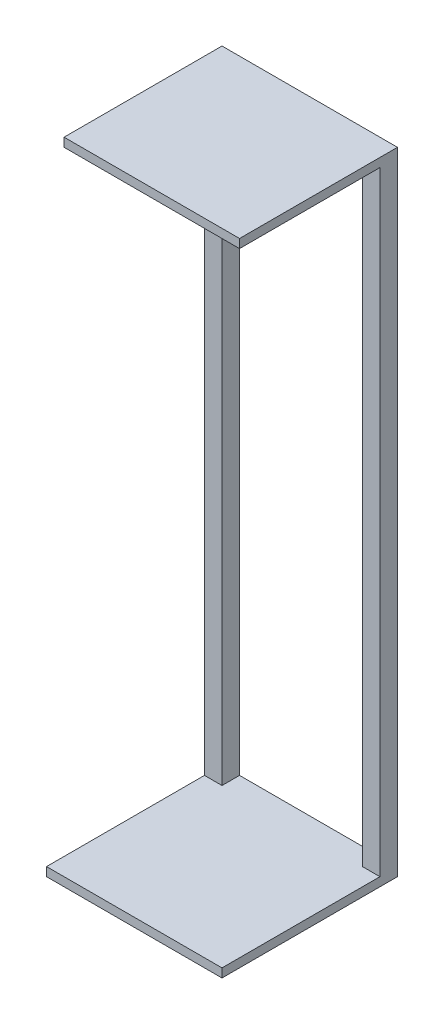
ISO-10303-21;
HEADER;
FILE_DESCRIPTION(('STEP AP214'),'2;1');
FILE_NAME('part.step','',(''),(''),'','','');
FILE_SCHEMA(('AUTOMOTIVE_DESIGN { 1 0 10303 214 1 1 1 1 }'));
ENDSEC;
DATA;
#1=APPLICATION_CONTEXT('core data for automotive mechanical design processes');
#2=APPLICATION_PROTOCOL_DEFINITION('international standard','automotive_design',2000,#1);
#3=PRODUCT_CONTEXT('',#1,'mechanical');
#4=PRODUCT('Part','Part','',(#3));
#5=PRODUCT_RELATED_PRODUCT_CATEGORY('part','',(#4));
#6=PRODUCT_DEFINITION_FORMATION('','',#4);
#7=PRODUCT_DEFINITION_CONTEXT('part definition',#1,'design');
#8=PRODUCT_DEFINITION('design','',#6,#7);
#9=PRODUCT_DEFINITION_SHAPE('','',#8);
#10=(LENGTH_UNIT() NAMED_UNIT(*) SI_UNIT(.MILLI.,.METRE.));
#11=(NAMED_UNIT(*) PLANE_ANGLE_UNIT() SI_UNIT($,.RADIAN.));
#12=(NAMED_UNIT(*) SI_UNIT($,.STERADIAN.) SOLID_ANGLE_UNIT());
#13=UNCERTAINTY_MEASURE_WITH_UNIT(LENGTH_MEASURE(1.E-05),#10,'distance_accuracy_value','');
#14=(GEOMETRIC_REPRESENTATION_CONTEXT(3) GLOBAL_UNCERTAINTY_ASSIGNED_CONTEXT((#13)) GLOBAL_UNIT_ASSIGNED_CONTEXT((#10,
#11,#12)) REPRESENTATION_CONTEXT('',''));
#15=CARTESIAN_POINT('',(0.,0.,0.));
#16=DIRECTION('',(0.,0.,1.));
#17=DIRECTION('',(1.,0.,0.));
#18=AXIS2_PLACEMENT_3D('',#15,#16,#17);
#19=CARTESIAN_POINT('',(0.,690.,-180.));
#20=DIRECTION('',(0.,0.,1.));
#21=DIRECTION('',(1.,0.,0.));
#22=AXIS2_PLACEMENT_3D('',#19,#20,#21);
#23=PLANE('',#22);
#24=DIRECTION('',(0.,-1.,0.));
#25=VECTOR('',#24,1.);
#26=CARTESIAN_POINT('',(85.,710.,-180.));
#27=LINE('',#26,#25);
#28=CARTESIAN_POINT('',(85.,710.,-180.));
#29=VERTEX_POINT('',#28);
#30=CARTESIAN_POINT('',(85.,690.,-180.));
#31=VERTEX_POINT('',#30);
#32=EDGE_CURVE('E250',#29,#31,#27,.T.);
#33=ORIENTED_EDGE('',*,*,#32,.F.);
#34=DIRECTION('',(1.,0.,0.));
#35=VECTOR('',#34,1.);
#36=CARTESIAN_POINT('',(0.,710.,-180.));
#37=LINE('',#36,#35);
#38=CARTESIAN_POINT('',(80.,710.,-180.));
#39=VERTEX_POINT('',#38);
#40=EDGE_CURVE('E272',#39,#29,#37,.T.);
#41=ORIENTED_EDGE('',*,*,#40,.F.);
#42=DIRECTION('',(0.,1.,0.));
#43=VECTOR('',#42,1.);
#44=CARTESIAN_POINT('',(80.,690.,-180.));
#45=LINE('',#44,#43);
#46=CARTESIAN_POINT('',(80.,690.,-180.));
#47=VERTEX_POINT('',#46);
#48=EDGE_CURVE('E278',#47,#39,#45,.T.);
#49=ORIENTED_EDGE('',*,*,#48,.F.);
#50=DIRECTION('',(1.,0.,0.));
#51=VECTOR('',#50,1.);
#52=CARTESIAN_POINT('',(0.,690.,-180.));
#53=LINE('',#52,#51);
#54=EDGE_CURVE('E262',#47,#31,#53,.T.);
#55=ORIENTED_EDGE('',*,*,#54,.T.);
#56=EDGE_LOOP('',(#33,#41,#49,#55));
#57=FACE_BOUND('',#56,.T.);
#58=ADVANCED_FACE('F39',(#57),#23,.T.);
#59=CARTESIAN_POINT('',(51.7157287525381,690.,-190.));
#60=DIRECTION('',(1.,0.,0.));
#61=DIRECTION('',(0.,0.,-1.));
#62=AXIS2_PLACEMENT_3D('',#59,#60,#61);
#63=CYLINDRICAL_SURFACE('',#62,10.);
#64=CARTESIAN_POINT('',(85.,690.,-190.));
#65=DIRECTION('',(-1.,0.,0.));
#66=DIRECTION('',(0.,0.,1.));
#67=AXIS2_PLACEMENT_3D('',#64,#65,#66);
#68=CIRCLE('',#67,10.);
#69=CARTESIAN_POINT('',(85.,690.,-200.));
#70=VERTEX_POINT('',#69);
#71=EDGE_CURVE('E11',#31,#70,#68,.F.);
#72=ORIENTED_EDGE('',*,*,#71,.F.);
#73=ORIENTED_EDGE('',*,*,#54,.F.);
#74=CARTESIAN_POINT('',(80.,690.,-190.));
#75=DIRECTION('',(1.,0.,0.));
#76=DIRECTION('',(0.,0.,-1.));
#77=AXIS2_PLACEMENT_3D('',#74,#75,#76);
#78=CIRCLE('',#77,10.);
#79=CARTESIAN_POINT('',(80.,690.,-200.));
#80=VERTEX_POINT('',#79);
#81=EDGE_CURVE('E258',#80,#47,#78,.F.);
#82=ORIENTED_EDGE('',*,*,#81,.F.);
#83=DIRECTION('',(1.,0.,0.));
#84=VECTOR('',#83,1.);
#85=CARTESIAN_POINT('',(0.,690.,-200.));
#86=LINE('',#85,#84);
#87=EDGE_CURVE('E266',#80,#70,#86,.T.);
#88=ORIENTED_EDGE('',*,*,#87,.T.);
#89=EDGE_LOOP('',(#72,#73,#82,#88));
#90=FACE_BOUND('',#89,.T.);
#91=ADVANCED_FACE('F497',(#90),#63,.T.);
#92=CARTESIAN_POINT('',(0.,690.,-100.));
#93=DIRECTION('',(0.,0.,1.));
#94=DIRECTION('',(1.,0.,0.));
#95=AXIS2_PLACEMENT_3D('',#92,#93,#94);
#96=PLANE('',#95);
#97=DIRECTION('',(0.,-1.,0.));
#98=VECTOR('',#97,1.);
#99=CARTESIAN_POINT('',(85.,710.,-100.));
#100=LINE('',#99,#98);
#101=CARTESIAN_POINT('',(85.,710.,-100.));
#102=VERTEX_POINT('',#101);
#103=CARTESIAN_POINT('',(85.,690.,-100.));
#104=VERTEX_POINT('',#103);
#105=EDGE_CURVE('E287',#102,#104,#100,.T.);
#106=ORIENTED_EDGE('',*,*,#105,.F.);
#107=DIRECTION('',(1.,0.,0.));
#108=VECTOR('',#107,1.);
#109=CARTESIAN_POINT('',(0.,710.,-100.));
#110=LINE('',#109,#108);
#111=CARTESIAN_POINT('',(80.,710.,-100.));
#112=VERTEX_POINT('',#111);
#113=EDGE_CURVE('E321',#112,#102,#110,.T.);
#114=ORIENTED_EDGE('',*,*,#113,.F.);
#115=DIRECTION('',(0.,1.,0.));
#116=VECTOR('',#115,1.);
#117=CARTESIAN_POINT('',(80.,690.,-100.));
#118=LINE('',#117,#116);
#119=CARTESIAN_POINT('',(80.,690.,-100.));
#120=VERTEX_POINT('',#119);
#121=EDGE_CURVE('E335',#120,#112,#118,.T.);
#122=ORIENTED_EDGE('',*,*,#121,.F.);
#123=DIRECTION('',(1.,0.,0.));
#124=VECTOR('',#123,1.);
#125=CARTESIAN_POINT('',(0.,690.,-100.));
#126=LINE('',#125,#124);
#127=EDGE_CURVE('E309',#120,#104,#126,.T.);
#128=ORIENTED_EDGE('',*,*,#127,.T.);
#129=EDGE_LOOP('',(#106,#114,#122,#128));
#130=FACE_BOUND('',#129,.T.);
#131=ADVANCED_FACE('F499',(#130),#96,.T.);
#132=CARTESIAN_POINT('',(0.,690.,-120.));
#133=DIRECTION('',(0.,0.,1.));
#134=DIRECTION('',(1.,0.,0.));
#135=AXIS2_PLACEMENT_3D('',#132,#133,#134);
#136=PLANE('',#135);
#137=DIRECTION('',(1.,0.,0.));
#138=VECTOR('',#137,1.);
#139=CARTESIAN_POINT('',(0.,710.,-120.));
#140=LINE('',#139,#138);
#141=CARTESIAN_POINT('',(80.,710.,-120.));
#142=VERTEX_POINT('',#141);
#143=CARTESIAN_POINT('',(85.,710.,-120.));
#144=VERTEX_POINT('',#143);
#145=EDGE_CURVE('E328',#142,#144,#140,.T.);
#146=ORIENTED_EDGE('',*,*,#145,.T.);
#147=DIRECTION('',(0.,-1.,0.));
#148=VECTOR('',#147,1.);
#149=CARTESIAN_POINT('',(85.,690.,-120.));
#150=LINE('',#149,#148);
#151=CARTESIAN_POINT('',(85.,690.,-120.));
#152=VERTEX_POINT('',#151);
#153=EDGE_CURVE('E299',#144,#152,#150,.T.);
#154=ORIENTED_EDGE('',*,*,#153,.T.);
#155=DIRECTION('',(1.,0.,0.));
#156=VECTOR('',#155,1.);
#157=CARTESIAN_POINT('',(0.,690.,-120.));
#158=LINE('',#157,#156);
#159=CARTESIAN_POINT('',(80.,690.,-120.));
#160=VERTEX_POINT('',#159);
#161=EDGE_CURVE('E314',#160,#152,#158,.T.);
#162=ORIENTED_EDGE('',*,*,#161,.F.);
#163=DIRECTION('',(0.,1.,0.));
#164=VECTOR('',#163,1.);
#165=CARTESIAN_POINT('',(80.,690.,-120.));
#166=LINE('',#165,#164);
#167=EDGE_CURVE('E333',#160,#142,#166,.T.);
#168=ORIENTED_EDGE('',*,*,#167,.T.);
#169=EDGE_LOOP('',(#146,#154,#162,#168));
#170=FACE_BOUND('',#169,.T.);
#171=ADVANCED_FACE('F506',(#170),#136,.F.);
#172=CARTESIAN_POINT('',(51.7157287525381,690.,-110.));
#173=DIRECTION('',(1.,0.,0.));
#174=DIRECTION('',(0.,0.,-1.));
#175=AXIS2_PLACEMENT_3D('',#172,#173,#174);
#176=CYLINDRICAL_SURFACE('',#175,10.);
#177=CARTESIAN_POINT('',(85.,690.,-110.));
#178=DIRECTION('',(-1.,0.,0.));
#179=DIRECTION('',(0.,0.,1.));
#180=AXIS2_PLACEMENT_3D('',#177,#178,#179);
#181=CIRCLE('',#180,10.);
#182=EDGE_CURVE('E440',#104,#152,#181,.F.);
#183=ORIENTED_EDGE('',*,*,#182,.F.);
#184=ORIENTED_EDGE('',*,*,#127,.F.);
#185=CARTESIAN_POINT('',(80.,690.,-110.));
#186=DIRECTION('',(1.,0.,0.));
#187=DIRECTION('',(0.,0.,-1.));
#188=AXIS2_PLACEMENT_3D('',#185,#186,#187);
#189=CIRCLE('',#188,10.);
#190=EDGE_CURVE('E305',#160,#120,#189,.F.);
#191=ORIENTED_EDGE('',*,*,#190,.F.);
#192=ORIENTED_EDGE('',*,*,#161,.T.);
#193=EDGE_LOOP('',(#183,#184,#191,#192));
#194=FACE_BOUND('',#193,.T.);
#195=ADVANCED_FACE('F542',(#194),#176,.T.);
#196=CARTESIAN_POINT('',(0.,10.,0.));
#197=DIRECTION('',(0.,-1.,0.));
#198=DIRECTION('',(0.,0.,-1.));
#199=AXIS2_PLACEMENT_3D('',#196,#197,#198);
#200=PLANE('',#199);
#201=DIRECTION('',(1.,0.,0.));
#202=VECTOR('',#201,1.);
#203=CARTESIAN_POINT('',(0.,10.,-180.));
#204=LINE('',#203,#202);
#205=CARTESIAN_POINT('',(0.,10.,-180.));
#206=VERTEX_POINT('',#205);
#207=CARTESIAN_POINT('',(20.,10.,-180.));
#208=VERTEX_POINT('',#207);
#209=EDGE_CURVE('E380',#206,#208,#204,.T.);
#210=ORIENTED_EDGE('',*,*,#209,.F.);
#211=DIRECTION('',(0.,0.,1.));
#212=VECTOR('',#211,1.);
#213=CARTESIAN_POINT('',(0.,10.,0.));
#214=LINE('',#213,#212);
#215=CARTESIAN_POINT('',(0.,10.,0.));
#216=VERTEX_POINT('',#215);
#217=EDGE_CURVE('E410',#206,#216,#214,.T.);
#218=ORIENTED_EDGE('',*,*,#217,.T.);
#219=DIRECTION('',(1.,0.,0.));
#220=VECTOR('',#219,1.);
#221=CARTESIAN_POINT('',(0.,10.,0.));
#222=LINE('',#221,#220);
#223=CARTESIAN_POINT('',(200.,10.,0.));
#224=VERTEX_POINT('',#223);
#225=EDGE_CURVE('E412',#216,#224,#222,.T.);
#226=ORIENTED_EDGE('',*,*,#225,.T.);
#227=DIRECTION('',(0.,0.,-1.));
#228=VECTOR('',#227,1.);
#229=CARTESIAN_POINT('',(200.,10.,0.));
#230=LINE('',#229,#228);
#231=CARTESIAN_POINT('',(200.,10.,-180.));
#232=VERTEX_POINT('',#231);
#233=EDGE_CURVE('E415',#224,#232,#230,.T.);
#234=ORIENTED_EDGE('',*,*,#233,.T.);
#235=DIRECTION('',(1.,0.,0.));
#236=VECTOR('',#235,1.);
#237=CARTESIAN_POINT('',(200.,10.,-180.));
#238=LINE('',#237,#236);
#239=CARTESIAN_POINT('',(180.,10.,-180.));
#240=VERTEX_POINT('',#239);
#241=EDGE_CURVE('E393',#240,#232,#238,.T.);
#242=ORIENTED_EDGE('',*,*,#241,.F.);
#243=DIRECTION('',(0.,0.,1.));
#244=VECTOR('',#243,1.);
#245=CARTESIAN_POINT('',(180.,10.,-200.));
#246=LINE('',#245,#244);
#247=CARTESIAN_POINT('',(180.,10.,-200.));
#248=VERTEX_POINT('',#247);
#249=EDGE_CURVE('E384',#248,#240,#246,.T.);
#250=ORIENTED_EDGE('',*,*,#249,.F.);
#251=DIRECTION('',(-1.,0.,0.));
#252=VECTOR('',#251,1.);
#253=CARTESIAN_POINT('',(0.,10.,-200.));
#254=LINE('',#253,#252);
#255=CARTESIAN_POINT('',(20.,10.,-200.));
#256=VERTEX_POINT('',#255);
#257=EDGE_CURVE('E417',#248,#256,#254,.T.);
#258=ORIENTED_EDGE('',*,*,#257,.T.);
#259=DIRECTION('',(0.,0.,-1.));
#260=VECTOR('',#259,1.);
#261=CARTESIAN_POINT('',(20.,10.,-200.));
#262=LINE('',#261,#260);
#263=EDGE_CURVE('E377',#208,#256,#262,.T.);
#264=ORIENTED_EDGE('',*,*,#263,.F.);
#265=EDGE_LOOP('',(#210,#218,#226,#234,#242,#250,#258,#264));
#266=FACE_BOUND('',#265,.T.);
#267=ADVANCED_FACE('F574',(#266),#200,.F.);
#268=CARTESIAN_POINT('',(0.,10.,0.));
#269=DIRECTION('',(1.,0.,0.));
#270=DIRECTION('',(0.,0.,-1.));
#271=AXIS2_PLACEMENT_3D('',#268,#269,#270);
#272=PLANE('',#271);
#273=DIRECTION('',(0.,0.,1.));
#274=VECTOR('',#273,1.);
#275=CARTESIAN_POINT('',(0.,0.,0.));
#276=LINE('',#275,#274);
#277=CARTESIAN_POINT('',(0.,0.,-200.));
#278=VERTEX_POINT('',#277);
#279=CARTESIAN_POINT('',(0.,0.,0.));
#280=VERTEX_POINT('',#279);
#281=EDGE_CURVE('E409',#278,#280,#276,.T.);
#282=ORIENTED_EDGE('',*,*,#281,.T.);
#283=DIRECTION('',(0.,-1.,0.));
#284=VECTOR('',#283,1.);
#285=CARTESIAN_POINT('',(0.,10.,0.));
#286=LINE('',#285,#284);
#287=EDGE_CURVE('E435',#216,#280,#286,.T.);
#288=ORIENTED_EDGE('',*,*,#287,.F.);
#289=ORIENTED_EDGE('',*,*,#217,.F.);
#290=DIRECTION('',(0.,-1.,0.));
#291=VECTOR('',#290,1.);
#292=CARTESIAN_POINT('',(0.,710.,-180.));
#293=LINE('',#292,#291);
#294=CARTESIAN_POINT('',(0.,710.,-180.));
#295=VERTEX_POINT('',#294);
#296=EDGE_CURVE('E367',#295,#206,#293,.T.);
#297=ORIENTED_EDGE('',*,*,#296,.F.);
#298=DIRECTION('',(0.,0.,1.));
#299=VECTOR('',#298,1.);
#300=CARTESIAN_POINT('',(0.,710.,-200.));
#301=LINE('',#300,#299);
#302=CARTESIAN_POINT('',(0.,710.,-20.));
#303=VERTEX_POINT('',#302);
#304=EDGE_CURVE('E359',#295,#303,#301,.T.);
#305=ORIENTED_EDGE('',*,*,#304,.T.);
#306=DIRECTION('',(0.,-1.,0.));
#307=VECTOR('',#306,1.);
#308=CARTESIAN_POINT('',(0.,720.,-20.));
#309=LINE('',#308,#307);
#310=CARTESIAN_POINT('',(0.,720.,-20.));
#311=VERTEX_POINT('',#310);
#312=EDGE_CURVE('E364',#311,#303,#309,.T.);
#313=ORIENTED_EDGE('',*,*,#312,.F.);
#314=DIRECTION('',(0.,0.,1.));
#315=VECTOR('',#314,1.);
#316=CARTESIAN_POINT('',(0.,720.,-200.));
#317=LINE('',#316,#315);
#318=CARTESIAN_POINT('',(0.,720.,-200.));
#319=VERTEX_POINT('',#318);
#320=EDGE_CURVE('E348',#319,#311,#317,.T.);
#321=ORIENTED_EDGE('',*,*,#320,.F.);
#322=DIRECTION('',(0.,-1.,0.));
#323=VECTOR('',#322,1.);
#324=CARTESIAN_POINT('',(0.,10.,-200.));
#325=LINE('',#324,#323);
#326=EDGE_CURVE('E419',#319,#278,#325,.T.);
#327=ORIENTED_EDGE('',*,*,#326,.T.);
#328=EDGE_LOOP('',(#282,#288,#289,#297,#305,#313,#321,#327));
#329=FACE_BOUND('',#328,.T.);
#330=ADVANCED_FACE('F41',(#329),#272,.F.);
#331=CARTESIAN_POINT('',(0.,10.,0.));
#332=DIRECTION('',(0.,0.,-1.));
#333=DIRECTION('',(-1.,0.,0.));
#334=AXIS2_PLACEMENT_3D('',#331,#332,#333);
#335=PLANE('',#334);
#336=DIRECTION('',(1.,0.,0.));
#337=VECTOR('',#336,1.);
#338=CARTESIAN_POINT('',(0.,0.,0.));
#339=LINE('',#338,#337);
#340=CARTESIAN_POINT('',(200.,0.,0.));
#341=VERTEX_POINT('',#340);
#342=EDGE_CURVE('E422',#280,#341,#339,.T.);
#343=ORIENTED_EDGE('',*,*,#342,.T.);
#344=DIRECTION('',(0.,-1.,0.));
#345=VECTOR('',#344,1.);
#346=CARTESIAN_POINT('',(200.,10.,0.));
#347=LINE('',#346,#345);
#348=EDGE_CURVE('E432',#224,#341,#347,.T.);
#349=ORIENTED_EDGE('',*,*,#348,.F.);
#350=ORIENTED_EDGE('',*,*,#225,.F.);
#351=ORIENTED_EDGE('',*,*,#287,.T.);
#352=EDGE_LOOP('',(#343,#349,#350,#351));
#353=FACE_BOUND('',#352,.T.);
#354=ADVANCED_FACE('F583',(#353),#335,.F.);
#355=CARTESIAN_POINT('',(200.,10.,0.));
#356=DIRECTION('',(-1.,0.,0.));
#357=DIRECTION('',(0.,0.,1.));
#358=AXIS2_PLACEMENT_3D('',#355,#356,#357);
#359=PLANE('',#358);
#360=DIRECTION('',(0.,0.,-1.));
#361=VECTOR('',#360,1.);
#362=CARTESIAN_POINT('',(200.,0.,0.));
#363=LINE('',#362,#361);
#364=CARTESIAN_POINT('',(200.,0.,-200.));
#365=VERTEX_POINT('',#364);
#366=EDGE_CURVE('E424',#341,#365,#363,.T.);
#367=ORIENTED_EDGE('',*,*,#366,.T.);
#368=DIRECTION('',(0.,-1.,0.));
#369=VECTOR('',#368,1.);
#370=CARTESIAN_POINT('',(200.,10.,-200.));
#371=LINE('',#370,#369);
#372=CARTESIAN_POINT('',(200.,720.,-200.));
#373=VERTEX_POINT('',#372);
#374=EDGE_CURVE('E429',#373,#365,#371,.T.);
#375=ORIENTED_EDGE('',*,*,#374,.F.);
#376=DIRECTION('',(0.,0.,-1.));
#377=VECTOR('',#376,1.);
#378=CARTESIAN_POINT('',(200.,720.,-200.));
#379=LINE('',#378,#377);
#380=CARTESIAN_POINT('',(200.,720.,-20.));
#381=VERTEX_POINT('',#380);
#382=EDGE_CURVE('E341',#381,#373,#379,.T.);
#383=ORIENTED_EDGE('',*,*,#382,.F.);
#384=DIRECTION('',(0.,-1.,0.));
#385=VECTOR('',#384,1.);
#386=CARTESIAN_POINT('',(200.,720.,-20.));
#387=LINE('',#386,#385);
#388=CARTESIAN_POINT('',(200.,710.,-20.));
#389=VERTEX_POINT('',#388);
#390=EDGE_CURVE('E352',#381,#389,#387,.T.);
#391=ORIENTED_EDGE('',*,*,#390,.T.);
#392=DIRECTION('',(0.,0.,-1.));
#393=VECTOR('',#392,1.);
#394=CARTESIAN_POINT('',(200.,710.,-200.));
#395=LINE('',#394,#393);
#396=CARTESIAN_POINT('',(200.,710.,-180.));
#397=VERTEX_POINT('',#396);
#398=EDGE_CURVE('E340',#389,#397,#395,.T.);
#399=ORIENTED_EDGE('',*,*,#398,.T.);
#400=DIRECTION('',(0.,-1.,0.));
#401=VECTOR('',#400,1.);
#402=CARTESIAN_POINT('',(200.,710.,-180.));
#403=LINE('',#402,#401);
#404=EDGE_CURVE('E396',#397,#232,#403,.T.);
#405=ORIENTED_EDGE('',*,*,#404,.T.);
#406=ORIENTED_EDGE('',*,*,#233,.F.);
#407=ORIENTED_EDGE('',*,*,#348,.T.);
#408=EDGE_LOOP('',(#367,#375,#383,#391,#399,#405,#406,#407));
#409=FACE_BOUND('',#408,.T.);
#410=ADVANCED_FACE('F464',(#409),#359,.F.);
#411=CARTESIAN_POINT('',(0.,10.,-200.));
#412=DIRECTION('',(0.,0.,1.));
#413=DIRECTION('',(1.,0.,0.));
#414=AXIS2_PLACEMENT_3D('',#411,#412,#413);
#415=PLANE('',#414);
#416=DIRECTION('',(-1.,0.,0.));
#417=VECTOR('',#416,1.);
#418=CARTESIAN_POINT('',(85.,710.,-200.));
#419=LINE('',#418,#417);
#420=CARTESIAN_POINT('',(115.,710.,-200.));
#421=VERTEX_POINT('',#420);
#422=CARTESIAN_POINT('',(85.,710.,-200.));
#423=VERTEX_POINT('',#422);
#424=EDGE_CURVE('E230',#421,#423,#419,.T.);
#425=ORIENTED_EDGE('',*,*,#424,.T.);
#426=DIRECTION('',(0.,-1.,0.));
#427=VECTOR('',#426,1.);
#428=CARTESIAN_POINT('',(85.,710.,-200.));
#429=LINE('',#428,#427);
#430=EDGE_CURVE('E245',#423,#70,#429,.T.);
#431=ORIENTED_EDGE('',*,*,#430,.T.);
#432=ORIENTED_EDGE('',*,*,#87,.F.);
#433=DIRECTION('',(0.,1.,0.));
#434=VECTOR('',#433,1.);
#435=CARTESIAN_POINT('',(80.,690.,-200.));
#436=LINE('',#435,#434);
#437=CARTESIAN_POINT('',(80.0000000000001,710.,-200.));
#438=VERTEX_POINT('',#437);
#439=EDGE_CURVE('E63',#80,#438,#436,.T.);
#440=ORIENTED_EDGE('',*,*,#439,.T.);
#441=DIRECTION('',(-1.,0.,0.));
#442=VECTOR('',#441,1.);
#443=CARTESIAN_POINT('',(200.,710.,-200.));
#444=LINE('',#443,#442);
#445=CARTESIAN_POINT('',(20.,710.,-200.));
#446=VERTEX_POINT('',#445);
#447=EDGE_CURVE('E355',#438,#446,#444,.T.);
#448=ORIENTED_EDGE('',*,*,#447,.T.);
#449=DIRECTION('',(0.,-1.,0.));
#450=VECTOR('',#449,1.);
#451=CARTESIAN_POINT('',(20.,710.,-200.));
#452=LINE('',#451,#450);
#453=EDGE_CURVE('E373',#446,#256,#452,.T.);
#454=ORIENTED_EDGE('',*,*,#453,.T.);
#455=ORIENTED_EDGE('',*,*,#257,.F.);
#456=DIRECTION('',(0.,-1.,0.));
#457=VECTOR('',#456,1.);
#458=CARTESIAN_POINT('',(180.,710.,-200.));
#459=LINE('',#458,#457);
#460=CARTESIAN_POINT('',(180.,710.,-200.));
#461=VERTEX_POINT('',#460);
#462=EDGE_CURVE('E406',#461,#248,#459,.T.);
#463=ORIENTED_EDGE('',*,*,#462,.F.);
#464=CARTESIAN_POINT('',(120.,710.,-200.));
#465=VERTEX_POINT('',#464);
#466=EDGE_CURVE('E356',#461,#465,#444,.T.);
#467=ORIENTED_EDGE('',*,*,#466,.T.);
#468=DIRECTION('',(0.,1.,0.));
#469=VECTOR('',#468,1.);
#470=CARTESIAN_POINT('',(120.,690.,-200.));
#471=LINE('',#470,#469);
#472=CARTESIAN_POINT('',(120.,690.,-200.));
#473=VERTEX_POINT('',#472);
#474=EDGE_CURVE('E269',#473,#465,#471,.T.);
#475=ORIENTED_EDGE('',*,*,#474,.F.);
#476=CARTESIAN_POINT('',(115.,690.,-200.));
#477=VERTEX_POINT('',#476);
#478=EDGE_CURVE('E244',#477,#473,#86,.T.);
#479=ORIENTED_EDGE('',*,*,#478,.F.);
#480=DIRECTION('',(0.,1.,0.));
#481=VECTOR('',#480,1.);
#482=CARTESIAN_POINT('',(115.,710.,-200.));
#483=LINE('',#482,#481);
#484=EDGE_CURVE('E55',#477,#421,#483,.T.);
#485=ORIENTED_EDGE('',*,*,#484,.T.);
#486=EDGE_LOOP('',(#425,#431,#432,#440,#448,#454,#455,#463,#467,#475,#479,#485));
#487=FACE_BOUND('',#486,.T.);
#488=DIRECTION('',(-1.,0.,0.));
#489=VECTOR('',#488,1.);
#490=CARTESIAN_POINT('',(0.,0.,-200.));
#491=LINE('',#490,#489);
#492=EDGE_CURVE('E413',#365,#278,#491,.T.);
#493=ORIENTED_EDGE('',*,*,#492,.T.);
#494=ORIENTED_EDGE('',*,*,#326,.F.);
#495=DIRECTION('',(-1.,0.,0.));
#496=VECTOR('',#495,1.);
#497=CARTESIAN_POINT('',(200.,720.,-200.));
#498=LINE('',#497,#496);
#499=EDGE_CURVE('E344',#373,#319,#498,.T.);
#500=ORIENTED_EDGE('',*,*,#499,.F.);
#501=ORIENTED_EDGE('',*,*,#374,.T.);
#502=EDGE_LOOP('',(#493,#494,#500,#501));
#503=FACE_BOUND('',#502,.T.);
#504=ADVANCED_FACE('F241',(#487,#503),#415,.F.);
#505=CARTESIAN_POINT('',(0.,0.,0.));
#506=DIRECTION('',(0.,-1.,0.));
#507=DIRECTION('',(0.,0.,-1.));
#508=AXIS2_PLACEMENT_3D('',#505,#506,#507);
#509=PLANE('',#508);
#510=ORIENTED_EDGE('',*,*,#281,.F.);
#511=ORIENTED_EDGE('',*,*,#492,.F.);
#512=ORIENTED_EDGE('',*,*,#366,.F.);
#513=ORIENTED_EDGE('',*,*,#342,.F.);
#514=EDGE_LOOP('',(#510,#511,#512,#513));
#515=FACE_BOUND('',#514,.T.);
#516=ADVANCED_FACE('F573',(#515),#509,.T.);
#517=CARTESIAN_POINT('',(180.,710.,-200.));
#518=DIRECTION('',(1.,0.,0.));
#519=DIRECTION('',(0.,0.,-1.));
#520=AXIS2_PLACEMENT_3D('',#517,#518,#519);
#521=PLANE('',#520);
#522=ORIENTED_EDGE('',*,*,#249,.T.);
#523=DIRECTION('',(0.,-1.,0.));
#524=VECTOR('',#523,1.);
#525=CARTESIAN_POINT('',(180.,710.,-180.));
#526=LINE('',#525,#524);
#527=CARTESIAN_POINT('',(180.,710.,-180.));
#528=VERTEX_POINT('',#527);
#529=EDGE_CURVE('E403',#528,#240,#526,.T.);
#530=ORIENTED_EDGE('',*,*,#529,.F.);
#531=DIRECTION('',(0.,0.,1.));
#532=VECTOR('',#531,1.);
#533=CARTESIAN_POINT('',(180.,710.,-200.));
#534=LINE('',#533,#532);
#535=EDGE_CURVE('E389',#461,#528,#534,.T.);
#536=ORIENTED_EDGE('',*,*,#535,.F.);
#537=ORIENTED_EDGE('',*,*,#462,.T.);
#538=EDGE_LOOP('',(#522,#530,#536,#537));
#539=FACE_BOUND('',#538,.T.);
#540=ADVANCED_FACE('F458',(#539),#521,.F.);
#541=CARTESIAN_POINT('',(200.,710.,-180.));
#542=DIRECTION('',(0.,0.,-1.));
#543=DIRECTION('',(-1.,0.,0.));
#544=AXIS2_PLACEMENT_3D('',#541,#542,#543);
#545=PLANE('',#544);
#546=ORIENTED_EDGE('',*,*,#241,.T.);
#547=ORIENTED_EDGE('',*,*,#404,.F.);
#548=DIRECTION('',(1.,0.,0.));
#549=VECTOR('',#548,1.);
#550=CARTESIAN_POINT('',(200.,710.,-180.));
#551=LINE('',#550,#549);
#552=EDGE_CURVE('E392',#528,#397,#551,.T.);
#553=ORIENTED_EDGE('',*,*,#552,.F.);
#554=ORIENTED_EDGE('',*,*,#529,.T.);
#555=EDGE_LOOP('',(#546,#547,#553,#554));
#556=FACE_BOUND('',#555,.T.);
#557=ADVANCED_FACE('F566',(#556),#545,.F.);
#558=CARTESIAN_POINT('',(0.,710.,-180.));
#559=DIRECTION('',(0.,0.,-1.));
#560=DIRECTION('',(-1.,0.,0.));
#561=AXIS2_PLACEMENT_3D('',#558,#559,#560);
#562=PLANE('',#561);
#563=ORIENTED_EDGE('',*,*,#209,.T.);
#564=DIRECTION('',(0.,-1.,0.));
#565=VECTOR('',#564,1.);
#566=CARTESIAN_POINT('',(20.,710.,-180.));
#567=LINE('',#566,#565);
#568=CARTESIAN_POINT('',(20.,710.,-180.));
#569=VERTEX_POINT('',#568);
#570=EDGE_CURVE('E370',#569,#208,#567,.T.);
#571=ORIENTED_EDGE('',*,*,#570,.F.);
#572=DIRECTION('',(1.,0.,0.));
#573=VECTOR('',#572,1.);
#574=CARTESIAN_POINT('',(0.,710.,-180.));
#575=LINE('',#574,#573);
#576=EDGE_CURVE('E381',#295,#569,#575,.T.);
#577=ORIENTED_EDGE('',*,*,#576,.F.);
#578=ORIENTED_EDGE('',*,*,#296,.T.);
#579=EDGE_LOOP('',(#563,#571,#577,#578));
#580=FACE_BOUND('',#579,.T.);
#581=ADVANCED_FACE('F479',(#580),#562,.F.);
#582=CARTESIAN_POINT('',(20.,710.,-200.));
#583=DIRECTION('',(-1.,0.,0.));
#584=DIRECTION('',(0.,0.,1.));
#585=AXIS2_PLACEMENT_3D('',#582,#583,#584);
#586=PLANE('',#585);
#587=ORIENTED_EDGE('',*,*,#263,.T.);
#588=ORIENTED_EDGE('',*,*,#453,.F.);
#589=DIRECTION('',(0.,0.,-1.));
#590=VECTOR('',#589,1.);
#591=CARTESIAN_POINT('',(20.,710.,-200.));
#592=LINE('',#591,#590);
#593=EDGE_CURVE('E376',#569,#446,#592,.T.);
#594=ORIENTED_EDGE('',*,*,#593,.F.);
#595=ORIENTED_EDGE('',*,*,#570,.T.);
#596=EDGE_LOOP('',(#587,#588,#594,#595));
#597=FACE_BOUND('',#596,.T.);
#598=ADVANCED_FACE('F483',(#597),#586,.F.);
#599=CARTESIAN_POINT('',(0.,710.,0.));
#600=DIRECTION('',(0.,-1.,0.));
#601=DIRECTION('',(0.,0.,-1.));
#602=AXIS2_PLACEMENT_3D('',#599,#600,#601);
#603=PLANE('',#602);
#604=DIRECTION('',(0.,0.,-1.));
#605=VECTOR('',#604,1.);
#606=CARTESIAN_POINT('',(120.,710.,-80.));
#607=LINE('',#606,#605);
#608=CARTESIAN_POINT('',(120.,710.,-180.));
#609=VERTEX_POINT('',#608);
#610=EDGE_CURVE('E261',#609,#465,#607,.T.);
#611=ORIENTED_EDGE('',*,*,#610,.T.);
#612=ORIENTED_EDGE('',*,*,#466,.F.);
#613=ORIENTED_EDGE('',*,*,#535,.T.);
#614=ORIENTED_EDGE('',*,*,#552,.T.);
#615=ORIENTED_EDGE('',*,*,#398,.F.);
#616=DIRECTION('',(1.,0.,0.));
#617=VECTOR('',#616,1.);
#618=CARTESIAN_POINT('',(200.,710.,-20.));
#619=LINE('',#618,#617);
#620=EDGE_CURVE('E345',#303,#389,#619,.T.);
#621=ORIENTED_EDGE('',*,*,#620,.F.);
#622=ORIENTED_EDGE('',*,*,#304,.F.);
#623=ORIENTED_EDGE('',*,*,#576,.T.);
#624=ORIENTED_EDGE('',*,*,#593,.T.);
#625=ORIENTED_EDGE('',*,*,#447,.F.);
#626=DIRECTION('',(0.,0.,-1.));
#627=VECTOR('',#626,1.);
#628=CARTESIAN_POINT('',(80.,710.,-80.));
#629=LINE('',#628,#627);
#630=EDGE_CURVE('E274',#39,#438,#629,.T.);
#631=ORIENTED_EDGE('',*,*,#630,.F.);
#632=ORIENTED_EDGE('',*,*,#40,.T.);
#633=DIRECTION('',(0.,0.,1.));
#634=VECTOR('',#633,1.);
#635=CARTESIAN_POINT('',(85.,710.,-200.));
#636=LINE('',#635,#634);
#637=EDGE_CURVE('E229',#423,#29,#636,.T.);
#638=ORIENTED_EDGE('',*,*,#637,.F.);
#639=ORIENTED_EDGE('',*,*,#424,.F.);
#640=DIRECTION('',(0.,0.,1.));
#641=VECTOR('',#640,1.);
#642=CARTESIAN_POINT('',(115.,710.,-200.));
#643=LINE('',#642,#641);
#644=CARTESIAN_POINT('',(115.,710.,-180.));
#645=VERTEX_POINT('',#644);
#646=EDGE_CURVE('E222',#421,#645,#643,.T.);
#647=ORIENTED_EDGE('',*,*,#646,.T.);
#648=EDGE_CURVE('E271',#645,#609,#37,.T.);
#649=ORIENTED_EDGE('',*,*,#648,.T.);
#650=EDGE_LOOP('',(#611,#612,#613,#614,#615,#621,#622,#623,#624,#625,#631,#632,#638,#639,#647,#649));
#651=FACE_BOUND('',#650,.T.);
#652=CARTESIAN_POINT('',(115.,710.,-120.));
#653=VERTEX_POINT('',#652);
#654=CARTESIAN_POINT('',(120.,710.,-120.));
#655=VERTEX_POINT('',#654);
#656=EDGE_CURVE('E327',#653,#655,#140,.T.);
#657=ORIENTED_EDGE('',*,*,#656,.F.);
#658=DIRECTION('',(0.,0.,1.));
#659=VECTOR('',#658,1.);
#660=CARTESIAN_POINT('',(115.,710.,-200.));
#661=LINE('',#660,#659);
#662=CARTESIAN_POINT('',(115.,710.,-100.));
#663=VERTEX_POINT('',#662);
#664=EDGE_CURVE('E292',#653,#663,#661,.T.);
#665=ORIENTED_EDGE('',*,*,#664,.T.);
#666=CARTESIAN_POINT('',(120.,710.,-100.));
#667=VERTEX_POINT('',#666);
#668=EDGE_CURVE('E320',#663,#667,#110,.T.);
#669=ORIENTED_EDGE('',*,*,#668,.T.);
#670=DIRECTION('',(0.,0.,-1.));
#671=VECTOR('',#670,1.);
#672=CARTESIAN_POINT('',(120.,710.,0.));
#673=LINE('',#672,#671);
#674=EDGE_CURVE('E308',#667,#655,#673,.T.);
#675=ORIENTED_EDGE('',*,*,#674,.T.);
#676=EDGE_LOOP('',(#657,#665,#669,#675));
#677=FACE_BOUND('',#676,.T.);
#678=DIRECTION('',(0.,0.,1.));
#679=VECTOR('',#678,1.);
#680=CARTESIAN_POINT('',(85.,710.,-200.));
#681=LINE('',#680,#679);
#682=EDGE_CURVE('E293',#144,#102,#681,.T.);
#683=ORIENTED_EDGE('',*,*,#682,.F.);
#684=ORIENTED_EDGE('',*,*,#145,.F.);
#685=DIRECTION('',(0.,0.,-1.));
#686=VECTOR('',#685,1.);
#687=CARTESIAN_POINT('',(80.,710.,0.));
#688=LINE('',#687,#686);
#689=EDGE_CURVE('E324',#112,#142,#688,.T.);
#690=ORIENTED_EDGE('',*,*,#689,.F.);
#691=ORIENTED_EDGE('',*,*,#113,.T.);
#692=EDGE_LOOP('',(#683,#684,#690,#691));
#693=FACE_BOUND('',#692,.T.);
#694=ADVANCED_FACE('F234',(#651,#677,#693),#603,.T.);
#695=CARTESIAN_POINT('',(200.,720.,-20.));
#696=DIRECTION('',(0.,0.,-1.));
#697=DIRECTION('',(-1.,0.,0.));
#698=AXIS2_PLACEMENT_3D('',#695,#696,#697);
#699=PLANE('',#698);
#700=ORIENTED_EDGE('',*,*,#620,.T.);
#701=ORIENTED_EDGE('',*,*,#390,.F.);
#702=DIRECTION('',(1.,0.,0.));
#703=VECTOR('',#702,1.);
#704=CARTESIAN_POINT('',(200.,720.,-20.));
#705=LINE('',#704,#703);
#706=EDGE_CURVE('E350',#311,#381,#705,.T.);
#707=ORIENTED_EDGE('',*,*,#706,.F.);
#708=ORIENTED_EDGE('',*,*,#312,.T.);
#709=EDGE_LOOP('',(#700,#701,#707,#708));
#710=FACE_BOUND('',#709,.T.);
#711=ADVANCED_FACE('F470',(#710),#699,.F.);
#712=CARTESIAN_POINT('',(0.,720.,0.));
#713=DIRECTION('',(0.,-1.,0.));
#714=DIRECTION('',(0.,0.,-1.));
#715=AXIS2_PLACEMENT_3D('',#712,#713,#714);
#716=PLANE('',#715);
#717=ORIENTED_EDGE('',*,*,#382,.T.);
#718=ORIENTED_EDGE('',*,*,#499,.T.);
#719=ORIENTED_EDGE('',*,*,#320,.T.);
#720=ORIENTED_EDGE('',*,*,#706,.T.);
#721=EDGE_LOOP('',(#717,#718,#719,#720));
#722=FACE_BOUND('',#721,.T.);
#723=ADVANCED_FACE('F555',(#722),#716,.F.);
#724=CARTESIAN_POINT('',(120.,690.,0.));
#725=DIRECTION('',(1.,0.,0.));
#726=DIRECTION('',(0.,0.,-1.));
#727=AXIS2_PLACEMENT_3D('',#724,#725,#726);
#728=PLANE('',#727);
#729=DIRECTION('',(0.,1.,0.));
#730=VECTOR('',#729,1.);
#731=CARTESIAN_POINT('',(120.,690.,-100.));
#732=LINE('',#731,#730);
#733=CARTESIAN_POINT('',(120.,690.,-100.));
#734=VERTEX_POINT('',#733);
#735=EDGE_CURVE('E337',#734,#667,#732,.T.);
#736=ORIENTED_EDGE('',*,*,#735,.F.);
#737=CARTESIAN_POINT('',(120.,690.,-110.));
#738=DIRECTION('',(1.,0.,0.));
#739=DIRECTION('',(0.,0.,-1.));
#740=AXIS2_PLACEMENT_3D('',#737,#738,#739);
#741=CIRCLE('',#740,10.);
#742=CARTESIAN_POINT('',(120.,690.,-120.));
#743=VERTEX_POINT('',#742);
#744=EDGE_CURVE('E302',#734,#743,#741,.T.);
#745=ORIENTED_EDGE('',*,*,#744,.T.);
#746=DIRECTION('',(0.,1.,0.));
#747=VECTOR('',#746,1.);
#748=CARTESIAN_POINT('',(120.,690.,-120.));
#749=LINE('',#748,#747);
#750=EDGE_CURVE('E317',#743,#655,#749,.T.);
#751=ORIENTED_EDGE('',*,*,#750,.T.);
#752=ORIENTED_EDGE('',*,*,#674,.F.);
#753=EDGE_LOOP('',(#736,#745,#751,#752));
#754=FACE_BOUND('',#753,.T.);
#755=ADVANCED_FACE('F551',(#754),#728,.T.);
#756=DIRECTION('',(0.,1.,0.));
#757=VECTOR('',#756,1.);
#758=CARTESIAN_POINT('',(115.,710.,-100.));
#759=LINE('',#758,#757);
#760=CARTESIAN_POINT('',(115.,690.,-100.));
#761=VERTEX_POINT('',#760);
#762=EDGE_CURVE('E289',#761,#663,#759,.T.);
#763=ORIENTED_EDGE('',*,*,#762,.F.);
#764=EDGE_CURVE('E313',#761,#734,#126,.T.);
#765=ORIENTED_EDGE('',*,*,#764,.T.);
#766=ORIENTED_EDGE('',*,*,#735,.T.);
#767=ORIENTED_EDGE('',*,*,#668,.F.);
#768=EDGE_LOOP('',(#763,#765,#766,#767));
#769=FACE_BOUND('',#768,.T.);
#770=ADVANCED_FACE('F509',(#769),#96,.T.);
#771=CARTESIAN_POINT('',(80.,690.,0.));
#772=DIRECTION('',(1.,0.,0.));
#773=DIRECTION('',(0.,0.,-1.));
#774=AXIS2_PLACEMENT_3D('',#771,#772,#773);
#775=PLANE('',#774);
#776=ORIENTED_EDGE('',*,*,#167,.F.);
#777=ORIENTED_EDGE('',*,*,#190,.T.);
#778=ORIENTED_EDGE('',*,*,#121,.T.);
#779=ORIENTED_EDGE('',*,*,#689,.T.);
#780=EDGE_LOOP('',(#776,#777,#778,#779));
#781=FACE_BOUND('',#780,.T.);
#782=ADVANCED_FACE('F545',(#781),#775,.F.);
#783=CARTESIAN_POINT('',(115.,690.,-120.));
#784=VERTEX_POINT('',#783);
#785=EDGE_CURVE('E312',#784,#743,#158,.T.);
#786=ORIENTED_EDGE('',*,*,#785,.F.);
#787=DIRECTION('',(0.,1.,0.));
#788=VECTOR('',#787,1.);
#789=CARTESIAN_POINT('',(115.,690.,-120.));
#790=LINE('',#789,#788);
#791=EDGE_CURVE('E295',#784,#653,#790,.T.);
#792=ORIENTED_EDGE('',*,*,#791,.T.);
#793=ORIENTED_EDGE('',*,*,#656,.T.);
#794=ORIENTED_EDGE('',*,*,#750,.F.);
#795=EDGE_LOOP('',(#786,#792,#793,#794));
#796=FACE_BOUND('',#795,.T.);
#797=ADVANCED_FACE('F540',(#796),#136,.F.);
#798=CARTESIAN_POINT('',(115.,690.,-110.));
#799=DIRECTION('',(1.,0.,0.));
#800=DIRECTION('',(0.,0.,-1.));
#801=AXIS2_PLACEMENT_3D('',#798,#799,#800);
#802=CIRCLE('',#801,10.);
#803=EDGE_CURVE('E438',#784,#761,#802,.F.);
#804=ORIENTED_EDGE('',*,*,#803,.F.);
#805=ORIENTED_EDGE('',*,*,#785,.T.);
#806=ORIENTED_EDGE('',*,*,#744,.F.);
#807=ORIENTED_EDGE('',*,*,#764,.F.);
#808=EDGE_LOOP('',(#804,#805,#806,#807));
#809=FACE_BOUND('',#808,.T.);
#810=ADVANCED_FACE('F536',(#809),#176,.T.);
#811=CARTESIAN_POINT('',(85.,710.,-200.));
#812=DIRECTION('',(-1.,0.,0.));
#813=DIRECTION('',(0.,0.,1.));
#814=AXIS2_PLACEMENT_3D('',#811,#812,#813);
#815=PLANE('',#814);
#816=CARTESIAN_POINT('',(85.,690.,-110.));
#817=DIRECTION('',(-1.,0.,0.));
#818=DIRECTION('',(0.,0.,1.));
#819=AXIS2_PLACEMENT_3D('',#816,#817,#818);
#820=CIRCLE('',#819,5.00000000000001);
#821=CARTESIAN_POINT('',(85.,690.,-115.));
#822=VERTEX_POINT('',#821);
#823=EDGE_CURVE('E284',#822,#822,#820,.T.);
#824=ORIENTED_EDGE('',*,*,#823,.T.);
#825=EDGE_LOOP('',(#824));
#826=FACE_BOUND('',#825,.T.);
#827=ORIENTED_EDGE('',*,*,#682,.T.);
#828=ORIENTED_EDGE('',*,*,#105,.T.);
#829=ORIENTED_EDGE('',*,*,#182,.T.);
#830=ORIENTED_EDGE('',*,*,#153,.F.);
#831=EDGE_LOOP('',(#827,#828,#829,#830));
#832=FACE_BOUND('',#831,.T.);
#833=ADVANCED_FACE('F532',(#826,#832),#815,.F.);
#834=CARTESIAN_POINT('',(115.,710.,-200.));
#835=DIRECTION('',(1.,0.,0.));
#836=DIRECTION('',(0.,0.,-1.));
#837=AXIS2_PLACEMENT_3D('',#834,#835,#836);
#838=PLANE('',#837);
#839=CARTESIAN_POINT('',(115.,690.,-110.));
#840=DIRECTION('',(1.,0.,0.));
#841=DIRECTION('',(0.,0.,-1.));
#842=AXIS2_PLACEMENT_3D('',#839,#840,#841);
#843=CIRCLE('',#842,5.00000000000001);
#844=CARTESIAN_POINT('',(115.,690.,-115.));
#845=VERTEX_POINT('',#844);
#846=EDGE_CURVE('E283',#845,#845,#843,.T.);
#847=ORIENTED_EDGE('',*,*,#846,.T.);
#848=EDGE_LOOP('',(#847));
#849=FACE_BOUND('',#848,.T.);
#850=ORIENTED_EDGE('',*,*,#803,.T.);
#851=ORIENTED_EDGE('',*,*,#762,.T.);
#852=ORIENTED_EDGE('',*,*,#664,.F.);
#853=ORIENTED_EDGE('',*,*,#791,.F.);
#854=EDGE_LOOP('',(#850,#851,#852,#853));
#855=FACE_BOUND('',#854,.T.);
#856=ADVANCED_FACE('F528',(#849,#855),#838,.F.);
#857=CARTESIAN_POINT('',(65.8578643762691,690.,-110.));
#858=DIRECTION('',(1.,0.,0.));
#859=DIRECTION('',(0.,0.,-1.));
#860=AXIS2_PLACEMENT_3D('',#857,#858,#859);
#861=CYLINDRICAL_SURFACE('',#860,5.00000000000001);
#862=CARTESIAN_POINT('',(115.,690.,-115.));
#863=CARTESIAN_POINT('',(114.6875,690.,-115.));
#864=CARTESIAN_POINT('',(114.375,690.,-115.));
#865=CARTESIAN_POINT('',(113.75,690.,-115.));
#866=CARTESIAN_POINT('',(113.4375,690.,-115.));
#867=CARTESIAN_POINT('',(112.8125,690.,-115.));
#868=CARTESIAN_POINT('',(112.5,690.,-115.));
#869=CARTESIAN_POINT('',(111.875,690.,-115.));
#870=CARTESIAN_POINT('',(111.5625,690.,-115.));
#871=CARTESIAN_POINT('',(110.9375,690.,-115.));
#872=CARTESIAN_POINT('',(110.625,690.,-115.));
#873=CARTESIAN_POINT('',(110.,690.,-115.));
#874=CARTESIAN_POINT('',(109.6875,690.,-115.));
#875=CARTESIAN_POINT('',(109.0625,690.,-115.));
#876=CARTESIAN_POINT('',(108.75,690.,-115.));
#877=CARTESIAN_POINT('',(108.125,690.,-115.));
#878=CARTESIAN_POINT('',(107.8125,690.,-115.));
#879=CARTESIAN_POINT('',(107.1875,690.,-115.));
#880=CARTESIAN_POINT('',(106.875,690.,-115.));
#881=CARTESIAN_POINT('',(106.25,690.,-115.));
#882=CARTESIAN_POINT('',(105.9375,690.,-115.));
#883=CARTESIAN_POINT('',(105.3125,690.,-115.));
#884=CARTESIAN_POINT('',(105.,690.,-115.));
#885=CARTESIAN_POINT('',(104.375,690.,-115.));
#886=CARTESIAN_POINT('',(104.0625,690.,-115.));
#887=CARTESIAN_POINT('',(103.4375,690.,-115.));
#888=CARTESIAN_POINT('',(103.125,690.,-115.));
#889=CARTESIAN_POINT('',(102.5,690.,-115.));
#890=CARTESIAN_POINT('',(102.1875,690.,-115.));
#891=CARTESIAN_POINT('',(101.5625,690.,-115.));
#892=CARTESIAN_POINT('',(101.25,690.,-115.));
#893=CARTESIAN_POINT('',(100.625,690.,-115.));
#894=CARTESIAN_POINT('',(100.3125,690.,-115.));
#895=CARTESIAN_POINT('',(99.6875,690.,-115.));
#896=CARTESIAN_POINT('',(99.375,690.,-115.));
#897=CARTESIAN_POINT('',(98.75,690.,-115.));
#898=CARTESIAN_POINT('',(98.4375,690.,-115.));
#899=CARTESIAN_POINT('',(97.8125,690.,-115.));
#900=CARTESIAN_POINT('',(97.5,690.,-115.));
#901=CARTESIAN_POINT('',(96.875,690.,-115.));
#902=CARTESIAN_POINT('',(96.5625,690.,-115.));
#903=CARTESIAN_POINT('',(95.9375,690.,-115.));
#904=CARTESIAN_POINT('',(95.625,690.,-115.));
#905=CARTESIAN_POINT('',(95.,690.,-115.));
#906=CARTESIAN_POINT('',(94.6875,690.,-115.));
#907=CARTESIAN_POINT('',(94.0625,690.,-115.));
#908=CARTESIAN_POINT('',(93.75,690.,-115.));
#909=CARTESIAN_POINT('',(93.125,690.,-115.));
#910=CARTESIAN_POINT('',(92.8125,690.,-115.));
#911=CARTESIAN_POINT('',(92.1875,690.,-115.));
#912=CARTESIAN_POINT('',(91.875,690.,-115.));
#913=CARTESIAN_POINT('',(91.25,690.,-115.));
#914=CARTESIAN_POINT('',(90.9375,690.,-115.));
#915=CARTESIAN_POINT('',(90.3125,690.,-115.));
#916=CARTESIAN_POINT('',(90.,690.,-115.));
#917=CARTESIAN_POINT('',(89.375,690.,-115.));
#918=CARTESIAN_POINT('',(89.0625,690.,-115.));
#919=CARTESIAN_POINT('',(88.4375,690.,-115.));
#920=CARTESIAN_POINT('',(88.125,690.,-115.));
#921=CARTESIAN_POINT('',(87.5,690.,-115.));
#922=CARTESIAN_POINT('',(87.1875,690.,-115.));
#923=CARTESIAN_POINT('',(86.5625,690.,-115.));
#924=CARTESIAN_POINT('',(86.25,690.,-115.));
#925=CARTESIAN_POINT('',(85.625,690.,-115.));
#926=CARTESIAN_POINT('',(85.3125,690.,-115.));
#927=CARTESIAN_POINT('',(85.,690.,-115.));
#928=B_SPLINE_CURVE_WITH_KNOTS('',3,(#862,#863,#864,#865,#866,#867,#868,#869,#870,#871,#872,
#873,#874,#875,#876,#877,#878,#879,#880,#881,#882,#883,#884,#885,#886,#887,#888,#889,#890,#891,
#892,#893,#894,#895,#896,#897,#898,#899,#900,#901,#902,#903,#904,#905,#906,#907,#908,#909,#910,
#911,#912,#913,#914,#915,#916,#917,#918,#919,#920,#921,#922,#923,#924,#925,#926,#927),
.UNSPECIFIED.,.F.,.F.,(4,2,2,2,2,2,2,2,2,2,2,2,2,2,2,2,2,2,2,2,2,2,2,2,2,2,2,2,2,2,2,2,4),(0.,
0.937500000000008,1.87500000000002,2.8125,3.75,4.68750000000001,5.62500000000001,6.5625,
7.50000000000001,8.4375,9.37499999999999,10.3125,11.25,12.1875,13.125,14.0625,15.,15.9375,
16.875,17.8125,18.75,19.6875,20.625,21.5625,22.5,23.4375,24.375,25.3125,26.25,27.1875,28.125,
29.0625,30.),.UNSPECIFIED.);
#929=EDGE_CURVE('BSEAM525',#845,#822,#928,.T.);
#930=ORIENTED_EDGE('',*,*,#846,.F.);
#931=ORIENTED_EDGE('',*,*,#823,.F.);
#932=ORIENTED_EDGE('',*,*,#929,.T.);
#933=ORIENTED_EDGE('',*,*,#929,.F.);
#934=EDGE_LOOP('',(#930,#932,#931,#933));
#935=FACE_BOUND('',#934,.T.);
#936=ADVANCED_FACE('F525',(#935),#861,.T.);
#937=CARTESIAN_POINT('',(120.,690.,-80.));
#938=DIRECTION('',(1.,0.,0.));
#939=DIRECTION('',(0.,0.,-1.));
#940=AXIS2_PLACEMENT_3D('',#937,#938,#939);
#941=PLANE('',#940);
#942=DIRECTION('',(0.,1.,0.));
#943=VECTOR('',#942,1.);
#944=CARTESIAN_POINT('',(120.,690.,-180.));
#945=LINE('',#944,#943);
#946=CARTESIAN_POINT('',(120.,690.,-180.));
#947=VERTEX_POINT('',#946);
#948=EDGE_CURVE('E280',#947,#609,#945,.T.);
#949=ORIENTED_EDGE('',*,*,#948,.F.);
#950=CARTESIAN_POINT('',(120.,690.,-190.));
#951=DIRECTION('',(1.,0.,0.));
#952=DIRECTION('',(0.,0.,-1.));
#953=AXIS2_PLACEMENT_3D('',#950,#951,#952);
#954=CIRCLE('',#953,10.);
#955=EDGE_CURVE('E254',#947,#473,#954,.T.);
#956=ORIENTED_EDGE('',*,*,#955,.T.);
#957=ORIENTED_EDGE('',*,*,#474,.T.);
#958=ORIENTED_EDGE('',*,*,#610,.F.);
#959=EDGE_LOOP('',(#949,#956,#957,#958));
#960=FACE_BOUND('',#959,.T.);
#961=ADVANCED_FACE('F452',(#960),#941,.T.);
#962=DIRECTION('',(0.,1.,0.));
#963=VECTOR('',#962,1.);
#964=CARTESIAN_POINT('',(115.,710.,-180.));
#965=LINE('',#964,#963);
#966=CARTESIAN_POINT('',(115.,690.,-180.));
#967=VERTEX_POINT('',#966);
#968=EDGE_CURVE('E226',#967,#645,#965,.T.);
#969=ORIENTED_EDGE('',*,*,#968,.F.);
#970=EDGE_CURVE('E265',#967,#947,#53,.T.);
#971=ORIENTED_EDGE('',*,*,#970,.T.);
#972=ORIENTED_EDGE('',*,*,#948,.T.);
#973=ORIENTED_EDGE('',*,*,#648,.F.);
#974=EDGE_LOOP('',(#969,#971,#972,#973));
#975=FACE_BOUND('',#974,.T.);
#976=ADVANCED_FACE('F447',(#975),#23,.T.);
#977=CARTESIAN_POINT('',(80.,690.,-80.));
#978=DIRECTION('',(1.,0.,0.));
#979=DIRECTION('',(0.,0.,-1.));
#980=AXIS2_PLACEMENT_3D('',#977,#978,#979);
#981=PLANE('',#980);
#982=ORIENTED_EDGE('',*,*,#439,.F.);
#983=ORIENTED_EDGE('',*,*,#81,.T.);
#984=ORIENTED_EDGE('',*,*,#48,.T.);
#985=ORIENTED_EDGE('',*,*,#630,.T.);
#986=EDGE_LOOP('',(#982,#983,#984,#985));
#987=FACE_BOUND('',#986,.T.);
#988=ADVANCED_FACE('F488',(#987),#981,.F.);
#989=CARTESIAN_POINT('',(115.,690.,-190.));
#990=DIRECTION('',(1.,0.,0.));
#991=DIRECTION('',(0.,0.,-1.));
#992=AXIS2_PLACEMENT_3D('',#989,#990,#991);
#993=CIRCLE('',#992,10.);
#994=EDGE_CURVE('E48',#477,#967,#993,.F.);
#995=ORIENTED_EDGE('',*,*,#994,.F.);
#996=ORIENTED_EDGE('',*,*,#478,.T.);
#997=ORIENTED_EDGE('',*,*,#955,.F.);
#998=ORIENTED_EDGE('',*,*,#970,.F.);
#999=EDGE_LOOP('',(#995,#996,#997,#998));
#1000=FACE_BOUND('',#999,.T.);
#1001=ADVANCED_FACE('F450',(#1000),#63,.T.);
#1002=CARTESIAN_POINT('',(85.,710.,-200.));
#1003=DIRECTION('',(-1.,0.,0.));
#1004=DIRECTION('',(0.,0.,1.));
#1005=AXIS2_PLACEMENT_3D('',#1002,#1003,#1004);
#1006=PLANE('',#1005);
#1007=CARTESIAN_POINT('',(85.,690.,-190.));
#1008=DIRECTION('',(-1.,0.,0.));
#1009=DIRECTION('',(0.,0.,1.));
#1010=AXIS2_PLACEMENT_3D('',#1007,#1008,#1009);
#1011=CIRCLE('',#1010,5.00000000000001);
#1012=CARTESIAN_POINT('',(85.,690.,-195.));
#1013=VERTEX_POINT('',#1012);
#1014=EDGE_CURVE('E252',#1013,#1013,#1011,.T.);
#1015=ORIENTED_EDGE('',*,*,#1014,.T.);
#1016=EDGE_LOOP('',(#1015));
#1017=FACE_BOUND('',#1016,.T.);
#1018=ORIENTED_EDGE('',*,*,#71,.T.);
#1019=ORIENTED_EDGE('',*,*,#430,.F.);
#1020=ORIENTED_EDGE('',*,*,#637,.T.);
#1021=ORIENTED_EDGE('',*,*,#32,.T.);
#1022=EDGE_LOOP('',(#1018,#1019,#1020,#1021));
#1023=FACE_BOUND('',#1022,.T.);
#1024=ADVANCED_FACE('F495',(#1017,#1023),#1006,.F.);
#1025=CARTESIAN_POINT('',(115.,710.,-200.));
#1026=DIRECTION('',(1.,0.,0.));
#1027=DIRECTION('',(0.,0.,-1.));
#1028=AXIS2_PLACEMENT_3D('',#1025,#1026,#1027);
#1029=PLANE('',#1028);
#1030=CARTESIAN_POINT('',(115.,690.,-190.));
#1031=DIRECTION('',(1.,0.,0.));
#1032=DIRECTION('',(0.,0.,-1.));
#1033=AXIS2_PLACEMENT_3D('',#1030,#1031,#1032);
#1034=CIRCLE('',#1033,5.00000000000001);
#1035=CARTESIAN_POINT('',(115.,690.,-195.));
#1036=VERTEX_POINT('',#1035);
#1037=EDGE_CURVE('E43',#1036,#1036,#1034,.T.);
#1038=ORIENTED_EDGE('',*,*,#1037,.T.);
#1039=EDGE_LOOP('',(#1038));
#1040=FACE_BOUND('',#1039,.T.);
#1041=ORIENTED_EDGE('',*,*,#994,.T.);
#1042=ORIENTED_EDGE('',*,*,#968,.T.);
#1043=ORIENTED_EDGE('',*,*,#646,.F.);
#1044=ORIENTED_EDGE('',*,*,#484,.F.);
#1045=EDGE_LOOP('',(#1041,#1042,#1043,#1044));
#1046=FACE_BOUND('',#1045,.T.);
#1047=ADVANCED_FACE('F224',(#1040,#1046),#1029,.F.);
#1048=CARTESIAN_POINT('',(65.8578643762691,690.,-190.));
#1049=DIRECTION('',(1.,0.,0.));
#1050=DIRECTION('',(0.,0.,-1.));
#1051=AXIS2_PLACEMENT_3D('',#1048,#1049,#1050);
#1052=CYLINDRICAL_SURFACE('',#1051,5.00000000000001);
#1053=CARTESIAN_POINT('',(115.,690.,-195.));
#1054=CARTESIAN_POINT('',(114.6875,690.,-195.));
#1055=CARTESIAN_POINT('',(114.375,690.,-195.));
#1056=CARTESIAN_POINT('',(113.75,690.,-195.));
#1057=CARTESIAN_POINT('',(113.4375,690.,-195.));
#1058=CARTESIAN_POINT('',(112.8125,690.,-195.));
#1059=CARTESIAN_POINT('',(112.5,690.,-195.));
#1060=CARTESIAN_POINT('',(111.875,690.,-195.));
#1061=CARTESIAN_POINT('',(111.5625,690.,-195.));
#1062=CARTESIAN_POINT('',(110.9375,690.,-195.));
#1063=CARTESIAN_POINT('',(110.625,690.,-195.));
#1064=CARTESIAN_POINT('',(110.,690.,-195.));
#1065=CARTESIAN_POINT('',(109.6875,690.,-195.));
#1066=CARTESIAN_POINT('',(109.0625,690.,-195.));
#1067=CARTESIAN_POINT('',(108.75,690.,-195.));
#1068=CARTESIAN_POINT('',(108.125,690.,-195.));
#1069=CARTESIAN_POINT('',(107.8125,690.,-195.));
#1070=CARTESIAN_POINT('',(107.1875,690.,-195.));
#1071=CARTESIAN_POINT('',(106.875,690.,-195.));
#1072=CARTESIAN_POINT('',(106.25,690.,-195.));
#1073=CARTESIAN_POINT('',(105.9375,690.,-195.));
#1074=CARTESIAN_POINT('',(105.3125,690.,-195.));
#1075=CARTESIAN_POINT('',(105.,690.,-195.));
#1076=CARTESIAN_POINT('',(104.375,690.,-195.));
#1077=CARTESIAN_POINT('',(104.0625,690.,-195.));
#1078=CARTESIAN_POINT('',(103.4375,690.,-195.));
#1079=CARTESIAN_POINT('',(103.125,690.,-195.));
#1080=CARTESIAN_POINT('',(102.5,690.,-195.));
#1081=CARTESIAN_POINT('',(102.1875,690.,-195.));
#1082=CARTESIAN_POINT('',(101.5625,690.,-195.));
#1083=CARTESIAN_POINT('',(101.25,690.,-195.));
#1084=CARTESIAN_POINT('',(100.625,690.,-195.));
#1085=CARTESIAN_POINT('',(100.3125,690.,-195.));
#1086=CARTESIAN_POINT('',(99.6875,690.,-195.));
#1087=CARTESIAN_POINT('',(99.375,690.,-195.));
#1088=CARTESIAN_POINT('',(98.75,690.,-195.));
#1089=CARTESIAN_POINT('',(98.4375,690.,-195.));
#1090=CARTESIAN_POINT('',(97.8125,690.,-195.));
#1091=CARTESIAN_POINT('',(97.5,690.,-195.));
#1092=CARTESIAN_POINT('',(96.875,690.,-195.));
#1093=CARTESIAN_POINT('',(96.5625,690.,-195.));
#1094=CARTESIAN_POINT('',(95.9375,690.,-195.));
#1095=CARTESIAN_POINT('',(95.625,690.,-195.));
#1096=CARTESIAN_POINT('',(95.,690.,-195.));
#1097=CARTESIAN_POINT('',(94.6875,690.,-195.));
#1098=CARTESIAN_POINT('',(94.0625,690.,-195.));
#1099=CARTESIAN_POINT('',(93.75,690.,-195.));
#1100=CARTESIAN_POINT('',(93.125,690.,-195.));
#1101=CARTESIAN_POINT('',(92.8125,690.,-195.));
#1102=CARTESIAN_POINT('',(92.1875,690.,-195.));
#1103=CARTESIAN_POINT('',(91.875,690.,-195.));
#1104=CARTESIAN_POINT('',(91.25,690.,-195.));
#1105=CARTESIAN_POINT('',(90.9375,690.,-195.));
#1106=CARTESIAN_POINT('',(90.3125,690.,-195.));
#1107=CARTESIAN_POINT('',(90.,690.,-195.));
#1108=CARTESIAN_POINT('',(89.375,690.,-195.));
#1109=CARTESIAN_POINT('',(89.0625,690.,-195.));
#1110=CARTESIAN_POINT('',(88.4375,690.,-195.));
#1111=CARTESIAN_POINT('',(88.125,690.,-195.));
#1112=CARTESIAN_POINT('',(87.5,690.,-195.));
#1113=CARTESIAN_POINT('',(87.1875,690.,-195.));
#1114=CARTESIAN_POINT('',(86.5625,690.,-195.));
#1115=CARTESIAN_POINT('',(86.25,690.,-195.));
#1116=CARTESIAN_POINT('',(85.625,690.,-195.));
#1117=CARTESIAN_POINT('',(85.3125,690.,-195.));
#1118=CARTESIAN_POINT('',(85.,690.,-195.));
#1119=B_SPLINE_CURVE_WITH_KNOTS('',3,(#1053,#1054,#1055,#1056,#1057,#1058,#1059,#1060,#1061,
#1062,#1063,#1064,#1065,#1066,#1067,#1068,#1069,#1070,#1071,#1072,#1073,#1074,#1075,#1076,#1077,
#1078,#1079,#1080,#1081,#1082,#1083,#1084,#1085,#1086,#1087,#1088,#1089,#1090,#1091,#1092,#1093,
#1094,#1095,#1096,#1097,#1098,#1099,#1100,#1101,#1102,#1103,#1104,#1105,#1106,#1107,#1108,#1109,
#1110,#1111,#1112,#1113,#1114,#1115,#1116,#1117,#1118),.UNSPECIFIED.,.F.,.F.,(4,2,2,2,2,2,2,2,2,
2,2,2,2,2,2,2,2,2,2,2,2,2,2,2,2,2,2,2,2,2,2,2,4),(0.,0.937500000000008,1.87500000000002,2.8125,
3.75,4.68750000000001,5.62500000000001,6.5625,7.50000000000001,8.4375,9.37499999999999,10.3125,
11.25,12.1875,13.125,14.0625,15.,15.9375,16.875,17.8125,18.75,19.6875,20.625,21.5625,22.5,
23.4375,24.375,25.3125,26.25,27.1875,28.125,29.0625,30.),.UNSPECIFIED.);
#1120=EDGE_CURVE('BSEAM838',#1036,#1013,#1119,.T.);
#1121=ORIENTED_EDGE('',*,*,#1037,.F.);
#1122=ORIENTED_EDGE('',*,*,#1014,.F.);
#1123=ORIENTED_EDGE('',*,*,#1120,.T.);
#1124=ORIENTED_EDGE('',*,*,#1120,.F.);
#1125=EDGE_LOOP('',(#1121,#1123,#1122,#1124));
#1126=FACE_BOUND('',#1125,.T.);
#1127=ADVANCED_FACE('F838',(#1126),#1052,.T.);
#1128=CLOSED_SHELL('',(#58,#91,#131,#171,#195,#267,#330,#354,#410,#504,#516,#540,#557,#581,#598,
#694,#711,#723,#755,#770,#782,#797,#810,#833,#856,#936,#961,#976,#988,#1001,#1024,#1047,#1127));
#1129=MANIFOLD_SOLID_BREP('B2',#1128);
#1130=ADVANCED_BREP_SHAPE_REPRESENTATION('',(#18,#1129),#14);
#1131=SHAPE_DEFINITION_REPRESENTATION(#9,#1130);
ENDSEC;
END-ISO-10303-21;
